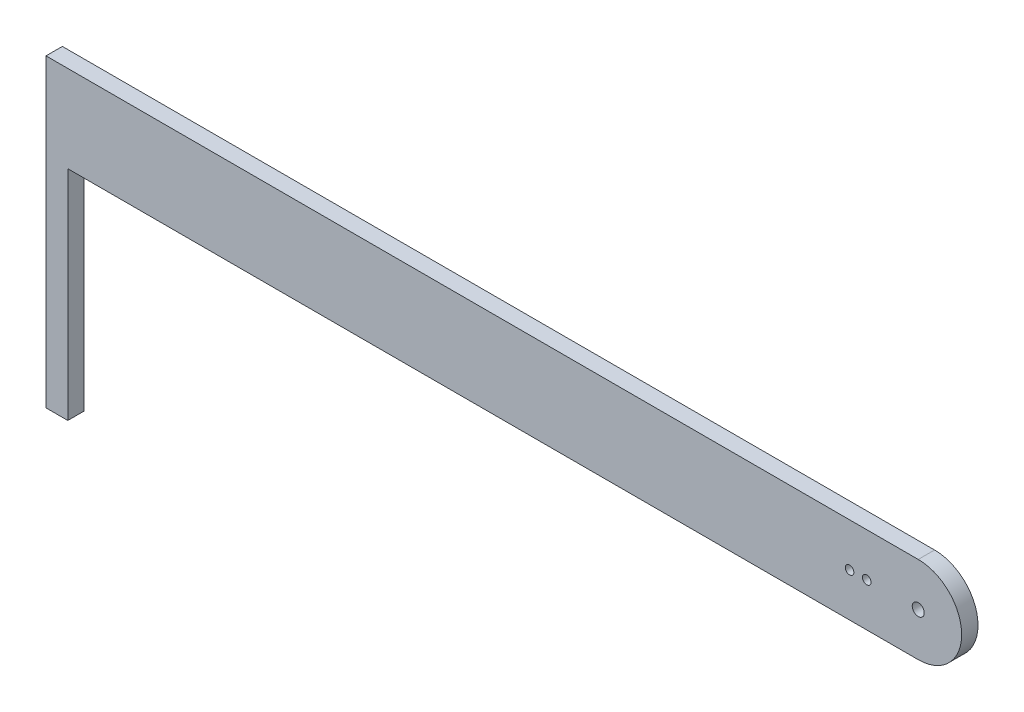
ISO-10303-21;
HEADER;
FILE_DESCRIPTION(('STEP AP214'),'2;1');
FILE_NAME('part.step','',(''),(''),'','','');
FILE_SCHEMA(('AUTOMOTIVE_DESIGN { 1 0 10303 214 1 1 1 1 }'));
ENDSEC;
DATA;
#1=APPLICATION_CONTEXT('core data for automotive mechanical design processes');
#2=APPLICATION_PROTOCOL_DEFINITION('international standard','automotive_design',2000,#1);
#3=PRODUCT_CONTEXT('',#1,'mechanical');
#4=PRODUCT('Part','Part','',(#3));
#5=PRODUCT_RELATED_PRODUCT_CATEGORY('part','',(#4));
#6=PRODUCT_DEFINITION_FORMATION('','',#4);
#7=PRODUCT_DEFINITION_CONTEXT('part definition',#1,'design');
#8=PRODUCT_DEFINITION('design','',#6,#7);
#9=PRODUCT_DEFINITION_SHAPE('','',#8);
#10=(LENGTH_UNIT() NAMED_UNIT(*) SI_UNIT(.MILLI.,.METRE.));
#11=(NAMED_UNIT(*) PLANE_ANGLE_UNIT() SI_UNIT($,.RADIAN.));
#12=(NAMED_UNIT(*) SI_UNIT($,.STERADIAN.) SOLID_ANGLE_UNIT());
#13=UNCERTAINTY_MEASURE_WITH_UNIT(LENGTH_MEASURE(1.E-05),#10,'distance_accuracy_value','');
#14=(GEOMETRIC_REPRESENTATION_CONTEXT(3) GLOBAL_UNCERTAINTY_ASSIGNED_CONTEXT((#13)) GLOBAL_UNIT_ASSIGNED_CONTEXT((#10,
#11,#12)) REPRESENTATION_CONTEXT('',''));
#15=CARTESIAN_POINT('',(0.,0.,0.));
#16=DIRECTION('',(0.,0.,1.));
#17=DIRECTION('',(1.,0.,0.));
#18=AXIS2_PLACEMENT_3D('',#15,#16,#17);
#19=CARTESIAN_POINT('',(-247.65,-76.1426177496269,4.7625));
#20=DIRECTION('',(-1.,0.,0.));
#21=DIRECTION('',(0.,-1.,0.));
#22=AXIS2_PLACEMENT_3D('',#19,#20,#21);
#23=PLANE('',#22);
#24=DIRECTION('',(0.,1.,0.));
#25=VECTOR('',#24,1.);
#26=CARTESIAN_POINT('',(-247.65,-76.1426177496269,0.));
#27=LINE('',#26,#25);
#28=CARTESIAN_POINT('',(-247.65,-76.1426177496269,0.));
#29=VERTEX_POINT('',#28);
#30=CARTESIAN_POINT('',(-247.65,-12.6426177496269,0.));
#31=VERTEX_POINT('',#30);
#32=EDGE_CURVE('E117',#29,#31,#27,.T.);
#33=ORIENTED_EDGE('',*,*,#32,.T.);
#34=DIRECTION('',(0.,0.,-1.));
#35=VECTOR('',#34,1.);
#36=CARTESIAN_POINT('',(-247.65,-12.6426177496269,4.7625));
#37=LINE('',#36,#35);
#38=CARTESIAN_POINT('',(-247.65,-12.6426177496269,4.7625));
#39=VERTEX_POINT('',#38);
#40=EDGE_CURVE('E11',#39,#31,#37,.T.);
#41=ORIENTED_EDGE('',*,*,#40,.F.);
#42=DIRECTION('',(0.,1.,0.));
#43=VECTOR('',#42,1.);
#44=CARTESIAN_POINT('',(-247.65,-76.1426177496269,4.7625));
#45=LINE('',#44,#43);
#46=CARTESIAN_POINT('',(-247.65,-76.1426177496269,4.7625));
#47=VERTEX_POINT('',#46);
#48=EDGE_CURVE('E128',#47,#39,#45,.T.);
#49=ORIENTED_EDGE('',*,*,#48,.F.);
#50=DIRECTION('',(0.,0.,-1.));
#51=VECTOR('',#50,1.);
#52=CARTESIAN_POINT('',(-247.65,-76.1426177496269,4.7625));
#53=LINE('',#52,#51);
#54=EDGE_CURVE('E113',#47,#29,#53,.T.);
#55=ORIENTED_EDGE('',*,*,#54,.T.);
#56=EDGE_LOOP('',(#33,#41,#49,#55));
#57=FACE_BOUND('',#56,.T.);
#58=ADVANCED_FACE('F33',(#57),#23,.F.);
#59=CARTESIAN_POINT('',(0.,-12.6426177496268,4.7625));
#60=DIRECTION('',(0.,1.,0.));
#61=DIRECTION('',(-1.,0.,0.));
#62=AXIS2_PLACEMENT_3D('',#59,#60,#61);
#63=PLANE('',#62);
#64=DIRECTION('',(1.,0.,0.));
#65=VECTOR('',#64,1.);
#66=CARTESIAN_POINT('',(0.,-12.6426177496268,0.));
#67=LINE('',#66,#65);
#68=CARTESIAN_POINT('',(0.,-12.6426177496268,0.));
#69=VERTEX_POINT('',#68);
#70=EDGE_CURVE('E120',#31,#69,#67,.T.);
#71=ORIENTED_EDGE('',*,*,#70,.T.);
#72=DIRECTION('',(0.,0.,-1.));
#73=VECTOR('',#72,1.);
#74=CARTESIAN_POINT('',(0.,-12.6426177496268,4.7625));
#75=LINE('',#74,#73);
#76=CARTESIAN_POINT('',(0.,-12.6426177496268,4.7625));
#77=VERTEX_POINT('',#76);
#78=EDGE_CURVE('E41',#77,#69,#75,.T.);
#79=ORIENTED_EDGE('',*,*,#78,.F.);
#80=DIRECTION('',(1.,0.,0.));
#81=VECTOR('',#80,1.);
#82=CARTESIAN_POINT('',(0.,-12.6426177496268,4.7625));
#83=LINE('',#82,#81);
#84=EDGE_CURVE('E85',#39,#77,#83,.T.);
#85=ORIENTED_EDGE('',*,*,#84,.F.);
#86=ORIENTED_EDGE('',*,*,#40,.T.);
#87=EDGE_LOOP('',(#71,#79,#85,#86));
#88=FACE_BOUND('',#87,.T.);
#89=ADVANCED_FACE('F153',(#88),#63,.F.);
#90=CARTESIAN_POINT('',(0.,0.,4.7625));
#91=DIRECTION('',(0.,0.,-1.));
#92=DIRECTION('',(-1.,0.,0.));
#93=AXIS2_PLACEMENT_3D('',#90,#91,#92);
#94=CYLINDRICAL_SURFACE('',#93,12.6426177496268);
#95=CARTESIAN_POINT('',(0.,0.,0.));
#96=DIRECTION('',(0.,0.,1.));
#97=DIRECTION('',(1.,0.,0.));
#98=AXIS2_PLACEMENT_3D('',#95,#96,#97);
#99=CIRCLE('',#98,12.6426177496268);
#100=CARTESIAN_POINT('',(0.,12.6426177496268,0.));
#101=VERTEX_POINT('',#100);
#102=EDGE_CURVE('E123',#69,#101,#99,.T.);
#103=ORIENTED_EDGE('',*,*,#102,.T.);
#104=DIRECTION('',(0.,0.,-1.));
#105=VECTOR('',#104,1.);
#106=CARTESIAN_POINT('',(0.,12.6426177496268,4.7625));
#107=LINE('',#106,#105);
#108=CARTESIAN_POINT('',(0.,12.6426177496268,4.7625));
#109=VERTEX_POINT('',#108);
#110=EDGE_CURVE('E108',#109,#101,#107,.T.);
#111=ORIENTED_EDGE('',*,*,#110,.F.);
#112=CARTESIAN_POINT('',(0.,0.,4.7625));
#113=DIRECTION('',(0.,0.,1.));
#114=DIRECTION('',(1.,0.,0.));
#115=AXIS2_PLACEMENT_3D('',#112,#113,#114);
#116=CIRCLE('',#115,12.6426177496268);
#117=EDGE_CURVE('E98',#77,#109,#116,.T.);
#118=ORIENTED_EDGE('',*,*,#117,.F.);
#119=ORIENTED_EDGE('',*,*,#78,.T.);
#120=EDGE_LOOP('',(#103,#111,#118,#119));
#121=FACE_BOUND('',#120,.T.);
#122=ADVANCED_FACE('F134',(#121),#94,.T.);
#123=CARTESIAN_POINT('',(0.,12.6426177496268,4.7625));
#124=DIRECTION('',(0.,-1.,0.));
#125=DIRECTION('',(1.,0.,0.));
#126=AXIS2_PLACEMENT_3D('',#123,#124,#125);
#127=PLANE('',#126);
#128=DIRECTION('',(-1.,0.,0.));
#129=VECTOR('',#128,1.);
#130=CARTESIAN_POINT('',(0.,12.6426177496268,0.));
#131=LINE('',#130,#129);
#132=CARTESIAN_POINT('',(-254.,12.6426177496268,0.));
#133=VERTEX_POINT('',#132);
#134=EDGE_CURVE('E107',#101,#133,#131,.T.);
#135=ORIENTED_EDGE('',*,*,#134,.T.);
#136=DIRECTION('',(0.,0.,-1.));
#137=VECTOR('',#136,1.);
#138=CARTESIAN_POINT('',(-254.,12.6426177496268,4.7625));
#139=LINE('',#138,#137);
#140=CARTESIAN_POINT('',(-254.,12.6426177496268,4.7625));
#141=VERTEX_POINT('',#140);
#142=EDGE_CURVE('E104',#141,#133,#139,.T.);
#143=ORIENTED_EDGE('',*,*,#142,.F.);
#144=DIRECTION('',(-1.,0.,0.));
#145=VECTOR('',#144,1.);
#146=CARTESIAN_POINT('',(0.,12.6426177496268,4.7625));
#147=LINE('',#146,#145);
#148=EDGE_CURVE('E92',#109,#141,#147,.T.);
#149=ORIENTED_EDGE('',*,*,#148,.F.);
#150=ORIENTED_EDGE('',*,*,#110,.T.);
#151=EDGE_LOOP('',(#135,#143,#149,#150));
#152=FACE_BOUND('',#151,.T.);
#153=ADVANCED_FACE('F105',(#152),#127,.F.);
#154=CARTESIAN_POINT('',(-254.,-76.1426177496269,4.7625));
#155=DIRECTION('',(1.,0.,0.));
#156=DIRECTION('',(0.,0.,-1.));
#157=AXIS2_PLACEMENT_3D('',#154,#155,#156);
#158=PLANE('',#157);
#159=DIRECTION('',(0.,-1.,0.));
#160=VECTOR('',#159,1.);
#161=CARTESIAN_POINT('',(-254.,-76.1426177496269,0.));
#162=LINE('',#161,#160);
#163=CARTESIAN_POINT('',(-254.,-76.1426177496269,0.));
#164=VERTEX_POINT('',#163);
#165=EDGE_CURVE('E71',#133,#164,#162,.T.);
#166=ORIENTED_EDGE('',*,*,#165,.T.);
#167=DIRECTION('',(0.,0.,-1.));
#168=VECTOR('',#167,1.);
#169=CARTESIAN_POINT('',(-254.,-76.1426177496269,4.7625));
#170=LINE('',#169,#168);
#171=CARTESIAN_POINT('',(-254.,-76.1426177496269,4.7625));
#172=VERTEX_POINT('',#171);
#173=EDGE_CURVE('E109',#172,#164,#170,.T.);
#174=ORIENTED_EDGE('',*,*,#173,.F.);
#175=DIRECTION('',(0.,-1.,0.));
#176=VECTOR('',#175,1.);
#177=CARTESIAN_POINT('',(-254.,12.6426177496268,4.7625));
#178=LINE('',#177,#176);
#179=EDGE_CURVE('E96',#141,#172,#178,.T.);
#180=ORIENTED_EDGE('',*,*,#179,.F.);
#181=ORIENTED_EDGE('',*,*,#142,.T.);
#182=EDGE_LOOP('',(#166,#174,#180,#181));
#183=FACE_BOUND('',#182,.T.);
#184=ADVANCED_FACE('F111',(#183),#158,.F.);
#185=CARTESIAN_POINT('',(-247.65,-76.1426177496269,4.7625));
#186=DIRECTION('',(0.,1.,0.));
#187=DIRECTION('',(-1.,0.,0.));
#188=AXIS2_PLACEMENT_3D('',#185,#186,#187);
#189=PLANE('',#188);
#190=DIRECTION('',(1.,0.,0.));
#191=VECTOR('',#190,1.);
#192=CARTESIAN_POINT('',(-247.65,-76.1426177496269,0.));
#193=LINE('',#192,#191);
#194=EDGE_CURVE('E77',#164,#29,#193,.T.);
#195=ORIENTED_EDGE('',*,*,#194,.T.);
#196=ORIENTED_EDGE('',*,*,#54,.F.);
#197=DIRECTION('',(1.,0.,0.));
#198=VECTOR('',#197,1.);
#199=CARTESIAN_POINT('',(-247.65,-76.1426177496269,4.7625));
#200=LINE('',#199,#198);
#201=EDGE_CURVE('E49',#172,#47,#200,.T.);
#202=ORIENTED_EDGE('',*,*,#201,.F.);
#203=ORIENTED_EDGE('',*,*,#173,.T.);
#204=EDGE_LOOP('',(#195,#196,#202,#203));
#205=FACE_BOUND('',#204,.T.);
#206=ADVANCED_FACE('F141',(#205),#189,.F.);
#207=CARTESIAN_POINT('',(0.,0.,4.7625));
#208=DIRECTION('',(0.,0.,1.));
#209=DIRECTION('',(1.,0.,0.));
#210=AXIS2_PLACEMENT_3D('',#207,#208,#209);
#211=PLANE('',#210);
#212=CARTESIAN_POINT('',(-1.17961196366423E-11,0.,4.7625));
#213=DIRECTION('',(0.,0.,1.));
#214=DIRECTION('',(1.,0.,0.));
#215=AXIS2_PLACEMENT_3D('',#212,#213,#214);
#216=CIRCLE('',#215,1.74999999999042);
#217=CARTESIAN_POINT('',(1.74999999997862,0.,4.7625));
#218=VERTEX_POINT('',#217);
#219=EDGE_CURVE('E230',#218,#218,#216,.T.);
#220=ORIENTED_EDGE('',*,*,#219,.F.);
#221=EDGE_LOOP('',(#220));
#222=FACE_BOUND('',#221,.T.);
#223=CARTESIAN_POINT('',(-20.,0.,4.7625));
#224=DIRECTION('',(0.,0.,1.));
#225=DIRECTION('',(1.,0.,0.));
#226=AXIS2_PLACEMENT_3D('',#223,#224,#225);
#227=CIRCLE('',#226,1.25);
#228=CARTESIAN_POINT('',(-18.75,0.,4.7625));
#229=VERTEX_POINT('',#228);
#230=EDGE_CURVE('E232',#229,#229,#227,.T.);
#231=ORIENTED_EDGE('',*,*,#230,.F.);
#232=EDGE_LOOP('',(#231));
#233=FACE_BOUND('',#232,.T.);
#234=CARTESIAN_POINT('',(-15.,0.,4.7625));
#235=DIRECTION('',(0.,0.,1.));
#236=DIRECTION('',(1.,0.,0.));
#237=AXIS2_PLACEMENT_3D('',#234,#235,#236);
#238=CIRCLE('',#237,1.25);
#239=CARTESIAN_POINT('',(-13.75,0.,4.7625));
#240=VERTEX_POINT('',#239);
#241=EDGE_CURVE('E238',#240,#240,#238,.T.);
#242=ORIENTED_EDGE('',*,*,#241,.F.);
#243=EDGE_LOOP('',(#242));
#244=FACE_BOUND('',#243,.T.);
#245=ORIENTED_EDGE('',*,*,#48,.T.);
#246=ORIENTED_EDGE('',*,*,#84,.T.);
#247=ORIENTED_EDGE('',*,*,#117,.T.);
#248=ORIENTED_EDGE('',*,*,#148,.T.);
#249=ORIENTED_EDGE('',*,*,#179,.T.);
#250=ORIENTED_EDGE('',*,*,#201,.T.);
#251=EDGE_LOOP('',(#245,#246,#247,#248,#249,#250));
#252=FACE_BOUND('',#251,.T.);
#253=ADVANCED_FACE('F94',(#222,#233,#244,#252),#211,.T.);
#254=CARTESIAN_POINT('',(0.,0.,0.));
#255=DIRECTION('',(0.,0.,1.));
#256=DIRECTION('',(1.,0.,0.));
#257=AXIS2_PLACEMENT_3D('',#254,#255,#256);
#258=PLANE('',#257);
#259=CARTESIAN_POINT('',(-1.17961196366423E-11,0.,0.));
#260=DIRECTION('',(0.,0.,1.));
#261=DIRECTION('',(1.,0.,0.));
#262=AXIS2_PLACEMENT_3D('',#259,#260,#261);
#263=CIRCLE('',#262,1.74999999999042);
#264=CARTESIAN_POINT('',(1.74999999997862,0.,0.));
#265=VERTEX_POINT('',#264);
#266=EDGE_CURVE('E227',#265,#265,#263,.T.);
#267=ORIENTED_EDGE('',*,*,#266,.T.);
#268=EDGE_LOOP('',(#267));
#269=FACE_BOUND('',#268,.T.);
#270=CARTESIAN_POINT('',(-20.,0.,0.));
#271=DIRECTION('',(0.,0.,1.));
#272=DIRECTION('',(1.,0.,0.));
#273=AXIS2_PLACEMENT_3D('',#270,#271,#272);
#274=CIRCLE('',#273,1.25);
#275=CARTESIAN_POINT('',(-18.75,0.,0.));
#276=VERTEX_POINT('',#275);
#277=EDGE_CURVE('E235',#276,#276,#274,.T.);
#278=ORIENTED_EDGE('',*,*,#277,.T.);
#279=EDGE_LOOP('',(#278));
#280=FACE_BOUND('',#279,.T.);
#281=CARTESIAN_POINT('',(-15.,0.,0.));
#282=DIRECTION('',(0.,0.,1.));
#283=DIRECTION('',(1.,0.,0.));
#284=AXIS2_PLACEMENT_3D('',#281,#282,#283);
#285=CIRCLE('',#284,1.25);
#286=CARTESIAN_POINT('',(-13.75,0.,0.));
#287=VERTEX_POINT('',#286);
#288=EDGE_CURVE('E121',#287,#287,#285,.T.);
#289=ORIENTED_EDGE('',*,*,#288,.T.);
#290=EDGE_LOOP('',(#289));
#291=FACE_BOUND('',#290,.T.);
#292=ORIENTED_EDGE('',*,*,#32,.F.);
#293=ORIENTED_EDGE('',*,*,#194,.F.);
#294=ORIENTED_EDGE('',*,*,#165,.F.);
#295=ORIENTED_EDGE('',*,*,#134,.F.);
#296=ORIENTED_EDGE('',*,*,#102,.F.);
#297=ORIENTED_EDGE('',*,*,#70,.F.);
#298=EDGE_LOOP('',(#292,#293,#294,#295,#296,#297));
#299=FACE_BOUND('',#298,.T.);
#300=ADVANCED_FACE('F137',(#269,#280,#291,#299),#258,.F.);
#301=CARTESIAN_POINT('',(-15.,0.,0.));
#302=DIRECTION('',(0.,0.,1.));
#303=DIRECTION('',(1.,0.,0.));
#304=AXIS2_PLACEMENT_3D('',#301,#302,#303);
#305=CYLINDRICAL_SURFACE('',#304,1.25);
#306=CARTESIAN_POINT('',(-13.75,0.,0.));
#307=CARTESIAN_POINT('',(-13.75,0.,0.049609375));
#308=CARTESIAN_POINT('',(-13.75,0.,0.09921875));
#309=CARTESIAN_POINT('',(-13.75,0.,0.1984375));
#310=CARTESIAN_POINT('',(-13.75,0.,0.248046875));
#311=CARTESIAN_POINT('',(-13.75,0.,0.347265625));
#312=CARTESIAN_POINT('',(-13.75,0.,0.396875));
#313=CARTESIAN_POINT('',(-13.75,0.,0.49609375));
#314=CARTESIAN_POINT('',(-13.75,0.,0.545703125));
#315=CARTESIAN_POINT('',(-13.75,0.,0.644921875));
#316=CARTESIAN_POINT('',(-13.75,0.,0.69453125));
#317=CARTESIAN_POINT('',(-13.75,0.,0.79375));
#318=CARTESIAN_POINT('',(-13.75,0.,0.843359375));
#319=CARTESIAN_POINT('',(-13.75,0.,0.942578125));
#320=CARTESIAN_POINT('',(-13.75,0.,0.9921875));
#321=CARTESIAN_POINT('',(-13.75,0.,1.09140625));
#322=CARTESIAN_POINT('',(-13.75,0.,1.141015625));
#323=CARTESIAN_POINT('',(-13.75,0.,1.240234375));
#324=CARTESIAN_POINT('',(-13.75,0.,1.28984375));
#325=CARTESIAN_POINT('',(-13.75,0.,1.3890625));
#326=CARTESIAN_POINT('',(-13.75,0.,1.438671875));
#327=CARTESIAN_POINT('',(-13.75,0.,1.537890625));
#328=CARTESIAN_POINT('',(-13.75,0.,1.5875));
#329=CARTESIAN_POINT('',(-13.75,0.,1.68671875));
#330=CARTESIAN_POINT('',(-13.75,0.,1.736328125));
#331=CARTESIAN_POINT('',(-13.75,0.,1.835546875));
#332=CARTESIAN_POINT('',(-13.75,0.,1.88515625));
#333=CARTESIAN_POINT('',(-13.75,0.,1.984375));
#334=CARTESIAN_POINT('',(-13.75,0.,2.033984375));
#335=CARTESIAN_POINT('',(-13.75,0.,2.133203125));
#336=CARTESIAN_POINT('',(-13.75,0.,2.1828125));
#337=CARTESIAN_POINT('',(-13.75,0.,2.28203125));
#338=CARTESIAN_POINT('',(-13.75,0.,2.331640625));
#339=CARTESIAN_POINT('',(-13.75,0.,2.430859375));
#340=CARTESIAN_POINT('',(-13.75,0.,2.48046875));
#341=CARTESIAN_POINT('',(-13.75,0.,2.5796875));
#342=CARTESIAN_POINT('',(-13.75,0.,2.629296875));
#343=CARTESIAN_POINT('',(-13.75,0.,2.728515625));
#344=CARTESIAN_POINT('',(-13.75,0.,2.778125));
#345=CARTESIAN_POINT('',(-13.75,0.,2.87734375));
#346=CARTESIAN_POINT('',(-13.75,0.,2.926953125));
#347=CARTESIAN_POINT('',(-13.75,0.,3.026171875));
#348=CARTESIAN_POINT('',(-13.75,0.,3.07578125));
#349=CARTESIAN_POINT('',(-13.75,0.,3.175));
#350=CARTESIAN_POINT('',(-13.75,0.,3.224609375));
#351=CARTESIAN_POINT('',(-13.75,0.,3.323828125));
#352=CARTESIAN_POINT('',(-13.75,0.,3.3734375));
#353=CARTESIAN_POINT('',(-13.75,0.,3.47265625));
#354=CARTESIAN_POINT('',(-13.75,0.,3.522265625));
#355=CARTESIAN_POINT('',(-13.75,0.,3.621484375));
#356=CARTESIAN_POINT('',(-13.75,0.,3.67109375));
#357=CARTESIAN_POINT('',(-13.75,0.,3.7703125));
#358=CARTESIAN_POINT('',(-13.75,0.,3.819921875));
#359=CARTESIAN_POINT('',(-13.75,0.,3.919140625));
#360=CARTESIAN_POINT('',(-13.75,0.,3.96875));
#361=CARTESIAN_POINT('',(-13.75,0.,4.06796875));
#362=CARTESIAN_POINT('',(-13.75,0.,4.117578125));
#363=CARTESIAN_POINT('',(-13.75,0.,4.216796875));
#364=CARTESIAN_POINT('',(-13.75,0.,4.26640625));
#365=CARTESIAN_POINT('',(-13.75,0.,4.365625));
#366=CARTESIAN_POINT('',(-13.75,0.,4.415234375));
#367=CARTESIAN_POINT('',(-13.75,0.,4.514453125));
#368=CARTESIAN_POINT('',(-13.75,0.,4.5640625));
#369=CARTESIAN_POINT('',(-13.75,0.,4.66328125));
#370=CARTESIAN_POINT('',(-13.75,0.,4.712890625));
#371=CARTESIAN_POINT('',(-13.75,0.,4.7625));
#372=B_SPLINE_CURVE_WITH_KNOTS('',3,(#306,#307,#308,#309,#310,#311,#312,#313,#314,#315,#316,
#317,#318,#319,#320,#321,#322,#323,#324,#325,#326,#327,#328,#329,#330,#331,#332,#333,#334,#335,
#336,#337,#338,#339,#340,#341,#342,#343,#344,#345,#346,#347,#348,#349,#350,#351,#352,#353,#354,
#355,#356,#357,#358,#359,#360,#361,#362,#363,#364,#365,#366,#367,#368,#369,#370,#371),
.UNSPECIFIED.,.F.,.F.,(4,2,2,2,2,2,2,2,2,2,2,2,2,2,2,2,2,2,2,2,2,2,2,2,2,2,2,2,2,2,2,2,4),(0.,
0.148828125,0.29765625,0.446484375,0.5953125,0.744140625,0.89296875,1.041796875,1.190625,
1.339453125,1.48828125,1.637109375,1.7859375,1.934765625,2.08359375,2.232421875,2.38125,
2.530078125,2.67890625,2.827734375,2.9765625,3.125390625,3.27421875,3.423046875,3.571875,
3.720703125,3.86953125,4.018359375,4.1671875,4.316015625,4.46484375,4.613671875,4.7625),.UNSPECIFIED.);
#373=EDGE_CURVE('BSEAM182',#287,#240,#372,.T.);
#374=ORIENTED_EDGE('',*,*,#288,.F.);
#375=ORIENTED_EDGE('',*,*,#241,.T.);
#376=ORIENTED_EDGE('',*,*,#373,.T.);
#377=ORIENTED_EDGE('',*,*,#373,.F.);
#378=EDGE_LOOP('',(#374,#376,#375,#377));
#379=FACE_BOUND('',#378,.T.);
#380=ADVANCED_FACE('F182',(#379),#305,.F.);
#381=CARTESIAN_POINT('',(-20.,0.,0.));
#382=DIRECTION('',(0.,0.,1.));
#383=DIRECTION('',(1.,0.,0.));
#384=AXIS2_PLACEMENT_3D('',#381,#382,#383);
#385=CYLINDRICAL_SURFACE('',#384,1.25);
#386=CARTESIAN_POINT('',(-18.75,0.,0.));
#387=CARTESIAN_POINT('',(-18.75,0.,0.049609375));
#388=CARTESIAN_POINT('',(-18.75,0.,0.09921875));
#389=CARTESIAN_POINT('',(-18.75,0.,0.1984375));
#390=CARTESIAN_POINT('',(-18.75,0.,0.248046875));
#391=CARTESIAN_POINT('',(-18.75,0.,0.347265625));
#392=CARTESIAN_POINT('',(-18.75,0.,0.396875));
#393=CARTESIAN_POINT('',(-18.75,0.,0.49609375));
#394=CARTESIAN_POINT('',(-18.75,0.,0.545703125));
#395=CARTESIAN_POINT('',(-18.75,0.,0.644921875));
#396=CARTESIAN_POINT('',(-18.75,0.,0.69453125));
#397=CARTESIAN_POINT('',(-18.75,0.,0.79375));
#398=CARTESIAN_POINT('',(-18.75,0.,0.843359375));
#399=CARTESIAN_POINT('',(-18.75,0.,0.942578125));
#400=CARTESIAN_POINT('',(-18.75,0.,0.9921875));
#401=CARTESIAN_POINT('',(-18.75,0.,1.09140625));
#402=CARTESIAN_POINT('',(-18.75,0.,1.141015625));
#403=CARTESIAN_POINT('',(-18.75,0.,1.240234375));
#404=CARTESIAN_POINT('',(-18.75,0.,1.28984375));
#405=CARTESIAN_POINT('',(-18.75,0.,1.3890625));
#406=CARTESIAN_POINT('',(-18.75,0.,1.438671875));
#407=CARTESIAN_POINT('',(-18.75,0.,1.537890625));
#408=CARTESIAN_POINT('',(-18.75,0.,1.5875));
#409=CARTESIAN_POINT('',(-18.75,0.,1.68671875));
#410=CARTESIAN_POINT('',(-18.75,0.,1.736328125));
#411=CARTESIAN_POINT('',(-18.75,0.,1.835546875));
#412=CARTESIAN_POINT('',(-18.75,0.,1.88515625));
#413=CARTESIAN_POINT('',(-18.75,0.,1.984375));
#414=CARTESIAN_POINT('',(-18.75,0.,2.033984375));
#415=CARTESIAN_POINT('',(-18.75,0.,2.133203125));
#416=CARTESIAN_POINT('',(-18.75,0.,2.1828125));
#417=CARTESIAN_POINT('',(-18.75,0.,2.28203125));
#418=CARTESIAN_POINT('',(-18.75,0.,2.331640625));
#419=CARTESIAN_POINT('',(-18.75,0.,2.430859375));
#420=CARTESIAN_POINT('',(-18.75,0.,2.48046875));
#421=CARTESIAN_POINT('',(-18.75,0.,2.5796875));
#422=CARTESIAN_POINT('',(-18.75,0.,2.629296875));
#423=CARTESIAN_POINT('',(-18.75,0.,2.728515625));
#424=CARTESIAN_POINT('',(-18.75,0.,2.778125));
#425=CARTESIAN_POINT('',(-18.75,0.,2.87734375));
#426=CARTESIAN_POINT('',(-18.75,0.,2.926953125));
#427=CARTESIAN_POINT('',(-18.75,0.,3.026171875));
#428=CARTESIAN_POINT('',(-18.75,0.,3.07578125));
#429=CARTESIAN_POINT('',(-18.75,0.,3.175));
#430=CARTESIAN_POINT('',(-18.75,0.,3.224609375));
#431=CARTESIAN_POINT('',(-18.75,0.,3.323828125));
#432=CARTESIAN_POINT('',(-18.75,0.,3.3734375));
#433=CARTESIAN_POINT('',(-18.75,0.,3.47265625));
#434=CARTESIAN_POINT('',(-18.75,0.,3.522265625));
#435=CARTESIAN_POINT('',(-18.75,0.,3.621484375));
#436=CARTESIAN_POINT('',(-18.75,0.,3.67109375));
#437=CARTESIAN_POINT('',(-18.75,0.,3.7703125));
#438=CARTESIAN_POINT('',(-18.75,0.,3.819921875));
#439=CARTESIAN_POINT('',(-18.75,0.,3.919140625));
#440=CARTESIAN_POINT('',(-18.75,0.,3.96875));
#441=CARTESIAN_POINT('',(-18.75,0.,4.06796875));
#442=CARTESIAN_POINT('',(-18.75,0.,4.117578125));
#443=CARTESIAN_POINT('',(-18.75,0.,4.216796875));
#444=CARTESIAN_POINT('',(-18.75,0.,4.26640625));
#445=CARTESIAN_POINT('',(-18.75,0.,4.365625));
#446=CARTESIAN_POINT('',(-18.75,0.,4.415234375));
#447=CARTESIAN_POINT('',(-18.75,0.,4.514453125));
#448=CARTESIAN_POINT('',(-18.75,0.,4.5640625));
#449=CARTESIAN_POINT('',(-18.75,0.,4.66328125));
#450=CARTESIAN_POINT('',(-18.75,0.,4.712890625));
#451=CARTESIAN_POINT('',(-18.75,0.,4.7625));
#452=B_SPLINE_CURVE_WITH_KNOTS('',3,(#386,#387,#388,#389,#390,#391,#392,#393,#394,#395,#396,
#397,#398,#399,#400,#401,#402,#403,#404,#405,#406,#407,#408,#409,#410,#411,#412,#413,#414,#415,
#416,#417,#418,#419,#420,#421,#422,#423,#424,#425,#426,#427,#428,#429,#430,#431,#432,#433,#434,
#435,#436,#437,#438,#439,#440,#441,#442,#443,#444,#445,#446,#447,#448,#449,#450,#451),
.UNSPECIFIED.,.F.,.F.,(4,2,2,2,2,2,2,2,2,2,2,2,2,2,2,2,2,2,2,2,2,2,2,2,2,2,2,2,2,2,2,2,4),(0.,
0.148828125,0.29765625,0.446484375,0.5953125,0.744140625,0.89296875,1.041796875,1.190625,
1.339453125,1.48828125,1.637109375,1.7859375,1.934765625,2.08359375,2.232421875,2.38125,
2.530078125,2.67890625,2.827734375,2.9765625,3.125390625,3.27421875,3.423046875,3.571875,
3.720703125,3.86953125,4.018359375,4.1671875,4.316015625,4.46484375,4.613671875,4.7625),.UNSPECIFIED.);
#453=EDGE_CURVE('BSEAM187',#276,#229,#452,.T.);
#454=ORIENTED_EDGE('',*,*,#277,.F.);
#455=ORIENTED_EDGE('',*,*,#230,.T.);
#456=ORIENTED_EDGE('',*,*,#453,.T.);
#457=ORIENTED_EDGE('',*,*,#453,.F.);
#458=EDGE_LOOP('',(#454,#456,#455,#457));
#459=FACE_BOUND('',#458,.T.);
#460=ADVANCED_FACE('F187',(#459),#385,.F.);
#461=CARTESIAN_POINT('',(-1.17961196366423E-11,0.,0.));
#462=DIRECTION('',(0.,0.,1.));
#463=DIRECTION('',(1.,0.,0.));
#464=AXIS2_PLACEMENT_3D('',#461,#462,#463);
#465=CYLINDRICAL_SURFACE('',#464,1.74999999999042);
#466=CARTESIAN_POINT('',(1.74999999997862,0.,0.));
#467=CARTESIAN_POINT('',(1.74999999997862,0.,0.049609375));
#468=CARTESIAN_POINT('',(1.74999999997862,0.,0.09921875));
#469=CARTESIAN_POINT('',(1.74999999997862,0.,0.1984375));
#470=CARTESIAN_POINT('',(1.74999999997862,0.,0.248046875));
#471=CARTESIAN_POINT('',(1.74999999997862,0.,0.347265625));
#472=CARTESIAN_POINT('',(1.74999999997862,0.,0.396875));
#473=CARTESIAN_POINT('',(1.74999999997862,0.,0.49609375));
#474=CARTESIAN_POINT('',(1.74999999997862,0.,0.545703125));
#475=CARTESIAN_POINT('',(1.74999999997862,0.,0.644921875));
#476=CARTESIAN_POINT('',(1.74999999997862,0.,0.69453125));
#477=CARTESIAN_POINT('',(1.74999999997862,0.,0.79375));
#478=CARTESIAN_POINT('',(1.74999999997862,0.,0.843359375));
#479=CARTESIAN_POINT('',(1.74999999997862,0.,0.942578125));
#480=CARTESIAN_POINT('',(1.74999999997862,0.,0.9921875));
#481=CARTESIAN_POINT('',(1.74999999997862,0.,1.09140625));
#482=CARTESIAN_POINT('',(1.74999999997862,0.,1.141015625));
#483=CARTESIAN_POINT('',(1.74999999997862,0.,1.240234375));
#484=CARTESIAN_POINT('',(1.74999999997862,0.,1.28984375));
#485=CARTESIAN_POINT('',(1.74999999997862,0.,1.3890625));
#486=CARTESIAN_POINT('',(1.74999999997862,0.,1.438671875));
#487=CARTESIAN_POINT('',(1.74999999997862,0.,1.537890625));
#488=CARTESIAN_POINT('',(1.74999999997862,0.,1.5875));
#489=CARTESIAN_POINT('',(1.74999999997862,0.,1.68671875));
#490=CARTESIAN_POINT('',(1.74999999997862,0.,1.736328125));
#491=CARTESIAN_POINT('',(1.74999999997862,0.,1.835546875));
#492=CARTESIAN_POINT('',(1.74999999997862,0.,1.88515625));
#493=CARTESIAN_POINT('',(1.74999999997862,0.,1.984375));
#494=CARTESIAN_POINT('',(1.74999999997862,0.,2.033984375));
#495=CARTESIAN_POINT('',(1.74999999997862,0.,2.133203125));
#496=CARTESIAN_POINT('',(1.74999999997862,0.,2.1828125));
#497=CARTESIAN_POINT('',(1.74999999997862,0.,2.28203125));
#498=CARTESIAN_POINT('',(1.74999999997862,0.,2.331640625));
#499=CARTESIAN_POINT('',(1.74999999997862,0.,2.430859375));
#500=CARTESIAN_POINT('',(1.74999999997862,0.,2.48046875));
#501=CARTESIAN_POINT('',(1.74999999997862,0.,2.5796875));
#502=CARTESIAN_POINT('',(1.74999999997862,0.,2.629296875));
#503=CARTESIAN_POINT('',(1.74999999997862,0.,2.728515625));
#504=CARTESIAN_POINT('',(1.74999999997862,0.,2.778125));
#505=CARTESIAN_POINT('',(1.74999999997862,0.,2.87734375));
#506=CARTESIAN_POINT('',(1.74999999997862,0.,2.926953125));
#507=CARTESIAN_POINT('',(1.74999999997862,0.,3.026171875));
#508=CARTESIAN_POINT('',(1.74999999997862,0.,3.07578125));
#509=CARTESIAN_POINT('',(1.74999999997862,0.,3.175));
#510=CARTESIAN_POINT('',(1.74999999997862,0.,3.224609375));
#511=CARTESIAN_POINT('',(1.74999999997862,0.,3.323828125));
#512=CARTESIAN_POINT('',(1.74999999997862,0.,3.3734375));
#513=CARTESIAN_POINT('',(1.74999999997862,0.,3.47265625));
#514=CARTESIAN_POINT('',(1.74999999997862,0.,3.522265625));
#515=CARTESIAN_POINT('',(1.74999999997862,0.,3.621484375));
#516=CARTESIAN_POINT('',(1.74999999997862,0.,3.67109375));
#517=CARTESIAN_POINT('',(1.74999999997862,0.,3.7703125));
#518=CARTESIAN_POINT('',(1.74999999997862,0.,3.819921875));
#519=CARTESIAN_POINT('',(1.74999999997862,0.,3.919140625));
#520=CARTESIAN_POINT('',(1.74999999997862,0.,3.96875));
#521=CARTESIAN_POINT('',(1.74999999997862,0.,4.06796875));
#522=CARTESIAN_POINT('',(1.74999999997862,0.,4.117578125));
#523=CARTESIAN_POINT('',(1.74999999997862,0.,4.216796875));
#524=CARTESIAN_POINT('',(1.74999999997862,0.,4.26640625));
#525=CARTESIAN_POINT('',(1.74999999997862,0.,4.365625));
#526=CARTESIAN_POINT('',(1.74999999997862,0.,4.415234375));
#527=CARTESIAN_POINT('',(1.74999999997862,0.,4.514453125));
#528=CARTESIAN_POINT('',(1.74999999997862,0.,4.5640625));
#529=CARTESIAN_POINT('',(1.74999999997862,0.,4.66328125));
#530=CARTESIAN_POINT('',(1.74999999997862,0.,4.712890625));
#531=CARTESIAN_POINT('',(1.74999999997862,0.,4.7625));
#532=B_SPLINE_CURVE_WITH_KNOTS('',3,(#466,#467,#468,#469,#470,#471,#472,#473,#474,#475,#476,
#477,#478,#479,#480,#481,#482,#483,#484,#485,#486,#487,#488,#489,#490,#491,#492,#493,#494,#495,
#496,#497,#498,#499,#500,#501,#502,#503,#504,#505,#506,#507,#508,#509,#510,#511,#512,#513,#514,
#515,#516,#517,#518,#519,#520,#521,#522,#523,#524,#525,#526,#527,#528,#529,#530,#531),
.UNSPECIFIED.,.F.,.F.,(4,2,2,2,2,2,2,2,2,2,2,2,2,2,2,2,2,2,2,2,2,2,2,2,2,2,2,2,2,2,2,2,4),(0.,
0.148828125,0.29765625,0.446484375,0.5953125,0.744140625,0.89296875,1.041796875,1.190625,
1.339453125,1.48828125,1.637109375,1.7859375,1.934765625,2.08359375,2.232421875,2.38125,
2.530078125,2.67890625,2.827734375,2.9765625,3.125390625,3.27421875,3.423046875,3.571875,
3.720703125,3.86953125,4.018359375,4.1671875,4.316015625,4.46484375,4.613671875,4.7625),.UNSPECIFIED.);
#533=EDGE_CURVE('BSEAM199',#265,#218,#532,.T.);
#534=ORIENTED_EDGE('',*,*,#266,.F.);
#535=ORIENTED_EDGE('',*,*,#219,.T.);
#536=ORIENTED_EDGE('',*,*,#533,.T.);
#537=ORIENTED_EDGE('',*,*,#533,.F.);
#538=EDGE_LOOP('',(#534,#536,#535,#537));
#539=FACE_BOUND('',#538,.T.);
#540=ADVANCED_FACE('F199',(#539),#465,.F.);
#541=CLOSED_SHELL('',(#58,#89,#122,#153,#184,#206,#253,#300,#380,#460,#540));
#542=MANIFOLD_SOLID_BREP('B2',#541);
#543=ADVANCED_BREP_SHAPE_REPRESENTATION('',(#18,#542),#14);
#544=SHAPE_DEFINITION_REPRESENTATION(#9,#543);
ENDSEC;
END-ISO-10303-21;
